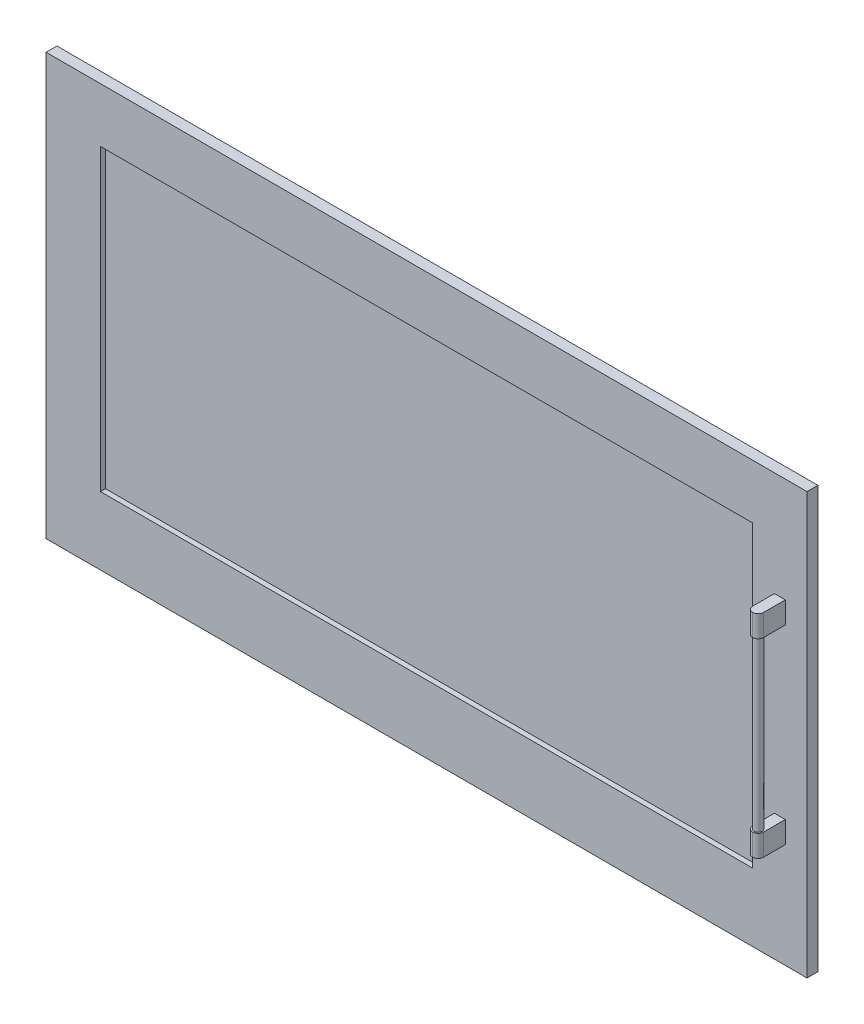
ISO-10303-21;
HEADER;
FILE_DESCRIPTION(('STEP AP214'),'2;1');
FILE_NAME('part.step','',(''),(''),'','','');
FILE_SCHEMA(('AUTOMOTIVE_DESIGN { 1 0 10303 214 1 1 1 1 }'));
ENDSEC;
DATA;
#1=APPLICATION_CONTEXT('core data for automotive mechanical design processes');
#2=APPLICATION_PROTOCOL_DEFINITION('international standard','automotive_design',2000,#1);
#3=PRODUCT_CONTEXT('',#1,'mechanical');
#4=PRODUCT('Part','Part','',(#3));
#5=PRODUCT_RELATED_PRODUCT_CATEGORY('part','',(#4));
#6=PRODUCT_DEFINITION_FORMATION('','',#4);
#7=PRODUCT_DEFINITION_CONTEXT('part definition',#1,'design');
#8=PRODUCT_DEFINITION('design','',#6,#7);
#9=PRODUCT_DEFINITION_SHAPE('','',#8);
#10=(LENGTH_UNIT() NAMED_UNIT(*) SI_UNIT(.MILLI.,.METRE.));
#11=(NAMED_UNIT(*) PLANE_ANGLE_UNIT() SI_UNIT($,.RADIAN.));
#12=(NAMED_UNIT(*) SI_UNIT($,.STERADIAN.) SOLID_ANGLE_UNIT());
#13=UNCERTAINTY_MEASURE_WITH_UNIT(LENGTH_MEASURE(1.E-05),#10,'distance_accuracy_value','');
#14=(GEOMETRIC_REPRESENTATION_CONTEXT(3) GLOBAL_UNCERTAINTY_ASSIGNED_CONTEXT((#13)) GLOBAL_UNIT_ASSIGNED_CONTEXT((#10,
#11,#12)) REPRESENTATION_CONTEXT('',''));
#15=CARTESIAN_POINT('',(0.,0.,0.));
#16=DIRECTION('',(0.,0.,1.));
#17=DIRECTION('',(1.,0.,0.));
#18=AXIS2_PLACEMENT_3D('',#15,#16,#17);
#19=CARTESIAN_POINT('',(-1199.5,574.5,18.));
#20=DIRECTION('',(-1.,0.,0.));
#21=DIRECTION('',(0.,-1.,0.));
#22=AXIS2_PLACEMENT_3D('',#19,#20,#21);
#23=PLANE('',#22);
#24=DIRECTION('',(0.,0.,1.));
#25=VECTOR('',#24,1.);
#26=CARTESIAN_POINT('',(-1199.5,-524.5,18.));
#27=LINE('',#26,#25);
#28=CARTESIAN_POINT('',(-1199.5,-524.5,18.));
#29=VERTEX_POINT('',#28);
#30=CARTESIAN_POINT('',(-1199.5,-524.5,22.));
#31=VERTEX_POINT('',#30);
#32=EDGE_CURVE('E48',#29,#31,#27,.T.);
#33=ORIENTED_EDGE('',*,*,#32,.T.);
#34=DIRECTION('',(0.,-1.,0.));
#35=VECTOR('',#34,1.);
#36=CARTESIAN_POINT('',(-1199.5,574.5,22.));
#37=LINE('',#36,#35);
#38=CARTESIAN_POINT('',(-1199.5,574.5,22.));
#39=VERTEX_POINT('',#38);
#40=EDGE_CURVE('E85',#39,#31,#37,.T.);
#41=ORIENTED_EDGE('',*,*,#40,.F.);
#42=DIRECTION('',(0.,0.,1.));
#43=VECTOR('',#42,1.);
#44=CARTESIAN_POINT('',(-1199.5,574.5,18.));
#45=LINE('',#44,#43);
#46=CARTESIAN_POINT('',(-1199.5,574.5,18.));
#47=VERTEX_POINT('',#46);
#48=EDGE_CURVE('E12',#47,#39,#45,.T.);
#49=ORIENTED_EDGE('',*,*,#48,.F.);
#50=DIRECTION('',(0.,-1.,0.));
#51=VECTOR('',#50,1.);
#52=CARTESIAN_POINT('',(-1199.5,574.5,18.));
#53=LINE('',#52,#51);
#54=EDGE_CURVE('E86',#47,#29,#53,.T.);
#55=ORIENTED_EDGE('',*,*,#54,.T.);
#56=EDGE_LOOP('',(#33,#41,#49,#55));
#57=FACE_BOUND('',#56,.T.);
#58=ADVANCED_FACE('F45',(#57),#23,.T.);
#59=CARTESIAN_POINT('',(-1199.5,574.5,18.));
#60=DIRECTION('',(0.,1.,0.));
#61=DIRECTION('',(0.,0.,1.));
#62=AXIS2_PLACEMENT_3D('',#59,#60,#61);
#63=PLANE('',#62);
#64=ORIENTED_EDGE('',*,*,#48,.T.);
#65=DIRECTION('',(-1.,0.,0.));
#66=VECTOR('',#65,1.);
#67=CARTESIAN_POINT('',(-1199.5,574.5,22.));
#68=LINE('',#67,#66);
#69=CARTESIAN_POINT('',(1199.5,574.5,22.));
#70=VERTEX_POINT('',#69);
#71=EDGE_CURVE('E102',#70,#39,#68,.T.);
#72=ORIENTED_EDGE('',*,*,#71,.F.);
#73=DIRECTION('',(0.,0.,1.));
#74=VECTOR('',#73,1.);
#75=CARTESIAN_POINT('',(1199.5,574.5,18.));
#76=LINE('',#75,#74);
#77=CARTESIAN_POINT('',(1199.5,574.5,18.));
#78=VERTEX_POINT('',#77);
#79=EDGE_CURVE('E53',#78,#70,#76,.T.);
#80=ORIENTED_EDGE('',*,*,#79,.F.);
#81=DIRECTION('',(-1.,0.,0.));
#82=VECTOR('',#81,1.);
#83=CARTESIAN_POINT('',(-1199.5,574.5,18.));
#84=LINE('',#83,#82);
#85=EDGE_CURVE('E91',#78,#47,#84,.T.);
#86=ORIENTED_EDGE('',*,*,#85,.T.);
#87=EDGE_LOOP('',(#64,#72,#80,#86));
#88=FACE_BOUND('',#87,.T.);
#89=ADVANCED_FACE('F117',(#88),#63,.T.);
#90=CARTESIAN_POINT('',(1199.5,574.5,18.));
#91=DIRECTION('',(1.,0.,0.));
#92=DIRECTION('',(0.,1.,0.));
#93=AXIS2_PLACEMENT_3D('',#90,#91,#92);
#94=PLANE('',#93);
#95=ORIENTED_EDGE('',*,*,#79,.T.);
#96=DIRECTION('',(0.,1.,0.));
#97=VECTOR('',#96,1.);
#98=CARTESIAN_POINT('',(1199.5,574.5,22.));
#99=LINE('',#98,#97);
#100=CARTESIAN_POINT('',(1199.5,-524.5,22.));
#101=VERTEX_POINT('',#100);
#102=EDGE_CURVE('E98',#101,#70,#99,.T.);
#103=ORIENTED_EDGE('',*,*,#102,.F.);
#104=DIRECTION('',(0.,0.,1.));
#105=VECTOR('',#104,1.);
#106=CARTESIAN_POINT('',(1199.5,-524.5,18.));
#107=LINE('',#106,#105);
#108=CARTESIAN_POINT('',(1199.5,-524.5,18.));
#109=VERTEX_POINT('',#108);
#110=EDGE_CURVE('E90',#109,#101,#107,.T.);
#111=ORIENTED_EDGE('',*,*,#110,.F.);
#112=DIRECTION('',(0.,1.,0.));
#113=VECTOR('',#112,1.);
#114=CARTESIAN_POINT('',(1199.5,574.5,18.));
#115=LINE('',#114,#113);
#116=EDGE_CURVE('E110',#109,#78,#115,.T.);
#117=ORIENTED_EDGE('',*,*,#116,.T.);
#118=EDGE_LOOP('',(#95,#103,#111,#117));
#119=FACE_BOUND('',#118,.T.);
#120=ADVANCED_FACE('F114',(#119),#94,.T.);
#121=CARTESIAN_POINT('',(-1199.5,-524.5,18.));
#122=DIRECTION('',(0.,-1.,0.));
#123=DIRECTION('',(0.,0.,-1.));
#124=AXIS2_PLACEMENT_3D('',#121,#122,#123);
#125=PLANE('',#124);
#126=ORIENTED_EDGE('',*,*,#110,.T.);
#127=DIRECTION('',(1.,0.,0.));
#128=VECTOR('',#127,1.);
#129=CARTESIAN_POINT('',(-1199.5,-524.5,22.));
#130=LINE('',#129,#128);
#131=EDGE_CURVE('E93',#31,#101,#130,.T.);
#132=ORIENTED_EDGE('',*,*,#131,.F.);
#133=ORIENTED_EDGE('',*,*,#32,.F.);
#134=DIRECTION('',(1.,0.,0.));
#135=VECTOR('',#134,1.);
#136=CARTESIAN_POINT('',(-1199.5,-524.5,18.));
#137=LINE('',#136,#135);
#138=EDGE_CURVE('E108',#29,#109,#137,.T.);
#139=ORIENTED_EDGE('',*,*,#138,.T.);
#140=EDGE_LOOP('',(#126,#132,#133,#139));
#141=FACE_BOUND('',#140,.T.);
#142=ADVANCED_FACE('F94',(#141),#125,.T.);
#143=CARTESIAN_POINT('',(0.,0.,18.));
#144=DIRECTION('',(0.,0.,1.));
#145=DIRECTION('',(1.,0.,0.));
#146=AXIS2_PLACEMENT_3D('',#143,#144,#145);
#147=PLANE('',#146);
#148=ORIENTED_EDGE('',*,*,#54,.F.);
#149=ORIENTED_EDGE('',*,*,#85,.F.);
#150=ORIENTED_EDGE('',*,*,#116,.F.);
#151=ORIENTED_EDGE('',*,*,#138,.F.);
#152=EDGE_LOOP('',(#148,#149,#150,#151));
#153=FACE_BOUND('',#152,.T.);
#154=ADVANCED_FACE('F119',(#153),#147,.F.);
#155=CARTESIAN_POINT('',(0.,0.,22.));
#156=DIRECTION('',(0.,0.,1.));
#157=DIRECTION('',(1.,0.,0.));
#158=AXIS2_PLACEMENT_3D('',#155,#156,#157);
#159=PLANE('',#158);
#160=ORIENTED_EDGE('',*,*,#40,.T.);
#161=ORIENTED_EDGE('',*,*,#131,.T.);
#162=ORIENTED_EDGE('',*,*,#102,.T.);
#163=ORIENTED_EDGE('',*,*,#71,.T.);
#164=EDGE_LOOP('',(#160,#161,#162,#163));
#165=FACE_BOUND('',#164,.T.);
#166=ADVANCED_FACE('F101',(#165),#159,.T.);
#167=CLOSED_SHELL('',(#58,#89,#120,#142,#154,#166));
#168=MANIFOLD_SOLID_BREP('B2',#167);
#169=CARTESIAN_POINT('',(0.,0.,40.));
#170=DIRECTION('',(0.,0.,1.));
#171=DIRECTION('',(1.,0.,0.));
#172=AXIS2_PLACEMENT_3D('',#169,#170,#171);
#173=PLANE('',#172);
#174=DIRECTION('',(0.,-1.,0.));
#175=VECTOR('',#174,1.);
#176=CARTESIAN_POINT('',(-1200.,575.,40.));
#177=LINE('',#176,#175);
#178=CARTESIAN_POINT('',(-1200.,575.,40.));
#179=VERTEX_POINT('',#178);
#180=CARTESIAN_POINT('',(-1200.,-525.,40.));
#181=VERTEX_POINT('',#180);
#182=EDGE_CURVE('E183',#179,#181,#177,.T.);
#183=ORIENTED_EDGE('',*,*,#182,.F.);
#184=DIRECTION('',(-1.,0.,0.));
#185=VECTOR('',#184,1.);
#186=CARTESIAN_POINT('',(-1200.,575.,40.));
#187=LINE('',#186,#185);
#188=CARTESIAN_POINT('',(1200.,575.,40.));
#189=VERTEX_POINT('',#188);
#190=EDGE_CURVE('E311',#189,#179,#187,.T.);
#191=ORIENTED_EDGE('',*,*,#190,.F.);
#192=DIRECTION('',(0.,1.,0.));
#193=VECTOR('',#192,1.);
#194=CARTESIAN_POINT('',(1200.,575.,40.));
#195=LINE('',#194,#193);
#196=CARTESIAN_POINT('',(1200.,-525.,40.));
#197=VERTEX_POINT('',#196);
#198=EDGE_CURVE('E296',#197,#189,#195,.T.);
#199=ORIENTED_EDGE('',*,*,#198,.F.);
#200=DIRECTION('',(1.,0.,0.));
#201=VECTOR('',#200,1.);
#202=CARTESIAN_POINT('',(-1200.,-525.,40.));
#203=LINE('',#202,#201);
#204=EDGE_CURVE('E305',#181,#197,#203,.T.);
#205=ORIENTED_EDGE('',*,*,#204,.F.);
#206=EDGE_LOOP('',(#183,#191,#199,#205));
#207=FACE_BOUND('',#206,.T.);
#208=DIRECTION('',(0.,1.,0.));
#209=VECTOR('',#208,1.);
#210=CARTESIAN_POINT('',(1400.,775.,40.));
#211=LINE('',#210,#209);
#212=CARTESIAN_POINT('',(1400.,-775.,40.));
#213=VERTEX_POINT('',#212);
#214=CARTESIAN_POINT('',(1400.,775.,40.));
#215=VERTEX_POINT('',#214);
#216=EDGE_CURVE('E363',#213,#215,#211,.T.);
#217=ORIENTED_EDGE('',*,*,#216,.T.);
#218=DIRECTION('',(-1.,0.,0.));
#219=VECTOR('',#218,1.);
#220=CARTESIAN_POINT('',(-1400.,775.,40.));
#221=LINE('',#220,#219);
#222=CARTESIAN_POINT('',(-1400.,775.,40.));
#223=VERTEX_POINT('',#222);
#224=EDGE_CURVE('E366',#215,#223,#221,.T.);
#225=ORIENTED_EDGE('',*,*,#224,.T.);
#226=DIRECTION('',(0.,-1.,0.));
#227=VECTOR('',#226,1.);
#228=CARTESIAN_POINT('',(-1400.,775.,40.));
#229=LINE('',#228,#227);
#230=CARTESIAN_POINT('',(-1400.,-775.,40.));
#231=VERTEX_POINT('',#230);
#232=EDGE_CURVE('E369',#223,#231,#229,.T.);
#233=ORIENTED_EDGE('',*,*,#232,.T.);
#234=DIRECTION('',(1.,0.,0.));
#235=VECTOR('',#234,1.);
#236=CARTESIAN_POINT('',(-1400.,-775.,40.));
#237=LINE('',#236,#235);
#238=EDGE_CURVE('E371',#231,#213,#237,.T.);
#239=ORIENTED_EDGE('',*,*,#238,.T.);
#240=EDGE_LOOP('',(#217,#225,#233,#239));
#241=FACE_BOUND('',#240,.T.);
#242=DIRECTION('',(-1.,0.,0.));
#243=VECTOR('',#242,1.);
#244=CARTESIAN_POINT('',(1280.,390.,40.));
#245=LINE('',#244,#243);
#246=CARTESIAN_POINT('',(1320.,390.,40.));
#247=VERTEX_POINT('',#246);
#248=CARTESIAN_POINT('',(1280.,390.,40.));
#249=VERTEX_POINT('',#248);
#250=EDGE_CURVE('E345',#247,#249,#245,.T.);
#251=ORIENTED_EDGE('',*,*,#250,.F.);
#252=DIRECTION('',(0.,1.,0.));
#253=VECTOR('',#252,1.);
#254=CARTESIAN_POINT('',(1320.,310.,40.));
#255=LINE('',#254,#253);
#256=CARTESIAN_POINT('',(1320.,310.,40.));
#257=VERTEX_POINT('',#256);
#258=EDGE_CURVE('E342',#257,#247,#255,.T.);
#259=ORIENTED_EDGE('',*,*,#258,.F.);
#260=DIRECTION('',(1.,0.,0.));
#261=VECTOR('',#260,1.);
#262=CARTESIAN_POINT('',(1280.,310.,40.));
#263=LINE('',#262,#261);
#264=CARTESIAN_POINT('',(1280.,310.,40.));
#265=VERTEX_POINT('',#264);
#266=EDGE_CURVE('E351',#265,#257,#263,.T.);
#267=ORIENTED_EDGE('',*,*,#266,.F.);
#268=DIRECTION('',(0.,-1.,0.));
#269=VECTOR('',#268,1.);
#270=CARTESIAN_POINT('',(1280.,310.,40.));
#271=LINE('',#270,#269);
#272=EDGE_CURVE('E348',#249,#265,#271,.T.);
#273=ORIENTED_EDGE('',*,*,#272,.F.);
#274=EDGE_LOOP('',(#251,#259,#267,#273));
#275=FACE_BOUND('',#274,.T.);
#276=DIRECTION('',(-1.,0.,0.));
#277=VECTOR('',#276,1.);
#278=CARTESIAN_POINT('',(1280.,-310.,40.));
#279=LINE('',#278,#277);
#280=CARTESIAN_POINT('',(1320.,-310.,40.));
#281=VERTEX_POINT('',#280);
#282=CARTESIAN_POINT('',(1280.,-310.,40.));
#283=VERTEX_POINT('',#282);
#284=EDGE_CURVE('E324',#281,#283,#279,.T.);
#285=ORIENTED_EDGE('',*,*,#284,.F.);
#286=DIRECTION('',(0.,1.,0.));
#287=VECTOR('',#286,1.);
#288=CARTESIAN_POINT('',(1320.,-390.,40.));
#289=LINE('',#288,#287);
#290=CARTESIAN_POINT('',(1320.,-390.,40.));
#291=VERTEX_POINT('',#290);
#292=EDGE_CURVE('E321',#291,#281,#289,.T.);
#293=ORIENTED_EDGE('',*,*,#292,.F.);
#294=DIRECTION('',(1.,0.,0.));
#295=VECTOR('',#294,1.);
#296=CARTESIAN_POINT('',(1280.,-390.,40.));
#297=LINE('',#296,#295);
#298=CARTESIAN_POINT('',(1280.,-390.,40.));
#299=VERTEX_POINT('',#298);
#300=EDGE_CURVE('E330',#299,#291,#297,.T.);
#301=ORIENTED_EDGE('',*,*,#300,.F.);
#302=DIRECTION('',(0.,-1.,0.));
#303=VECTOR('',#302,1.);
#304=CARTESIAN_POINT('',(1280.,-390.,40.));
#305=LINE('',#304,#303);
#306=EDGE_CURVE('E327',#283,#299,#305,.T.);
#307=ORIENTED_EDGE('',*,*,#306,.F.);
#308=EDGE_LOOP('',(#285,#293,#301,#307));
#309=FACE_BOUND('',#308,.T.);
#310=ADVANCED_FACE('F168',(#207,#241,#275,#309),#173,.T.);
#311=CARTESIAN_POINT('',(1400.,775.,40.));
#312=DIRECTION('',(-1.,0.,0.));
#313=DIRECTION('',(0.,0.,1.));
#314=AXIS2_PLACEMENT_3D('',#311,#312,#313);
#315=PLANE('',#314);
#316=DIRECTION('',(0.,1.,0.));
#317=VECTOR('',#316,1.);
#318=CARTESIAN_POINT('',(1400.,775.,0.));
#319=LINE('',#318,#317);
#320=CARTESIAN_POINT('',(1400.,-775.,0.));
#321=VERTEX_POINT('',#320);
#322=CARTESIAN_POINT('',(1400.,775.,0.));
#323=VERTEX_POINT('',#322);
#324=EDGE_CURVE('E362',#321,#323,#319,.T.);
#325=ORIENTED_EDGE('',*,*,#324,.T.);
#326=DIRECTION('',(0.,0.,-1.));
#327=VECTOR('',#326,1.);
#328=CARTESIAN_POINT('',(1400.,775.,40.));
#329=LINE('',#328,#327);
#330=EDGE_CURVE('E389',#215,#323,#329,.T.);
#331=ORIENTED_EDGE('',*,*,#330,.F.);
#332=ORIENTED_EDGE('',*,*,#216,.F.);
#333=DIRECTION('',(0.,0.,-1.));
#334=VECTOR('',#333,1.);
#335=CARTESIAN_POINT('',(1400.,-775.,40.));
#336=LINE('',#335,#334);
#337=EDGE_CURVE('E373',#213,#321,#336,.T.);
#338=ORIENTED_EDGE('',*,*,#337,.T.);
#339=EDGE_LOOP('',(#325,#331,#332,#338));
#340=FACE_BOUND('',#339,.T.);
#341=ADVANCED_FACE('F451',(#340),#315,.F.);
#342=CARTESIAN_POINT('',(-1400.,775.,40.));
#343=DIRECTION('',(0.,-1.,0.));
#344=DIRECTION('',(0.,0.,-1.));
#345=AXIS2_PLACEMENT_3D('',#342,#343,#344);
#346=PLANE('',#345);
#347=DIRECTION('',(-1.,0.,0.));
#348=VECTOR('',#347,1.);
#349=CARTESIAN_POINT('',(-1400.,775.,0.));
#350=LINE('',#349,#348);
#351=CARTESIAN_POINT('',(-1400.,775.,0.));
#352=VERTEX_POINT('',#351);
#353=EDGE_CURVE('E376',#323,#352,#350,.T.);
#354=ORIENTED_EDGE('',*,*,#353,.T.);
#355=DIRECTION('',(0.,0.,-1.));
#356=VECTOR('',#355,1.);
#357=CARTESIAN_POINT('',(-1400.,775.,40.));
#358=LINE('',#357,#356);
#359=EDGE_CURVE('E386',#223,#352,#358,.T.);
#360=ORIENTED_EDGE('',*,*,#359,.F.);
#361=ORIENTED_EDGE('',*,*,#224,.F.);
#362=ORIENTED_EDGE('',*,*,#330,.T.);
#363=EDGE_LOOP('',(#354,#360,#361,#362));
#364=FACE_BOUND('',#363,.T.);
#365=ADVANCED_FACE('F456',(#364),#346,.F.);
#366=CARTESIAN_POINT('',(-1400.,775.,40.));
#367=DIRECTION('',(1.,0.,0.));
#368=DIRECTION('',(0.,0.,-1.));
#369=AXIS2_PLACEMENT_3D('',#366,#367,#368);
#370=PLANE('',#369);
#371=DIRECTION('',(0.,-1.,0.));
#372=VECTOR('',#371,1.);
#373=CARTESIAN_POINT('',(-1400.,775.,0.));
#374=LINE('',#373,#372);
#375=CARTESIAN_POINT('',(-1400.,-775.,0.));
#376=VERTEX_POINT('',#375);
#377=EDGE_CURVE('E378',#352,#376,#374,.T.);
#378=ORIENTED_EDGE('',*,*,#377,.T.);
#379=DIRECTION('',(0.,0.,-1.));
#380=VECTOR('',#379,1.);
#381=CARTESIAN_POINT('',(-1400.,-775.,40.));
#382=LINE('',#381,#380);
#383=EDGE_CURVE('E383',#231,#376,#382,.T.);
#384=ORIENTED_EDGE('',*,*,#383,.F.);
#385=ORIENTED_EDGE('',*,*,#232,.F.);
#386=ORIENTED_EDGE('',*,*,#359,.T.);
#387=EDGE_LOOP('',(#378,#384,#385,#386));
#388=FACE_BOUND('',#387,.T.);
#389=ADVANCED_FACE('F468',(#388),#370,.F.);
#390=CARTESIAN_POINT('',(-1400.,-775.,40.));
#391=DIRECTION('',(0.,1.,0.));
#392=DIRECTION('',(0.,0.,1.));
#393=AXIS2_PLACEMENT_3D('',#390,#391,#392);
#394=PLANE('',#393);
#395=DIRECTION('',(1.,0.,0.));
#396=VECTOR('',#395,1.);
#397=CARTESIAN_POINT('',(-1400.,-775.,0.));
#398=LINE('',#397,#396);
#399=EDGE_CURVE('E367',#376,#321,#398,.T.);
#400=ORIENTED_EDGE('',*,*,#399,.T.);
#401=ORIENTED_EDGE('',*,*,#337,.F.);
#402=ORIENTED_EDGE('',*,*,#238,.F.);
#403=ORIENTED_EDGE('',*,*,#383,.T.);
#404=EDGE_LOOP('',(#400,#401,#402,#403));
#405=FACE_BOUND('',#404,.T.);
#406=ADVANCED_FACE('F465',(#405),#394,.F.);
#407=CARTESIAN_POINT('',(0.,0.,0.));
#408=DIRECTION('',(0.,0.,1.));
#409=DIRECTION('',(1.,0.,0.));
#410=AXIS2_PLACEMENT_3D('',#407,#408,#409);
#411=PLANE('',#410);
#412=DIRECTION('',(-1.,0.,0.));
#413=VECTOR('',#412,1.);
#414=CARTESIAN_POINT('',(0.,575.,0.));
#415=LINE('',#414,#413);
#416=CARTESIAN_POINT('',(1200.,575.,0.));
#417=VERTEX_POINT('',#416);
#418=CARTESIAN_POINT('',(-1200.,575.,0.));
#419=VERTEX_POINT('',#418);
#420=EDGE_CURVE('E176',#417,#419,#415,.T.);
#421=ORIENTED_EDGE('',*,*,#420,.T.);
#422=DIRECTION('',(0.,-1.,0.));
#423=VECTOR('',#422,1.);
#424=CARTESIAN_POINT('',(-1200.,-2.42230478100034E-13,0.));
#425=LINE('',#424,#423);
#426=CARTESIAN_POINT('',(-1200.,-525.,0.));
#427=VERTEX_POINT('',#426);
#428=EDGE_CURVE('E43',#419,#427,#425,.T.);
#429=ORIENTED_EDGE('',*,*,#428,.T.);
#430=DIRECTION('',(1.,0.,0.));
#431=VECTOR('',#430,1.);
#432=CARTESIAN_POINT('',(0.,-525.,0.));
#433=LINE('',#432,#431);
#434=CARTESIAN_POINT('',(1200.,-525.,0.));
#435=VERTEX_POINT('',#434);
#436=EDGE_CURVE('E428',#427,#435,#433,.T.);
#437=ORIENTED_EDGE('',*,*,#436,.T.);
#438=DIRECTION('',(0.,1.,0.));
#439=VECTOR('',#438,1.);
#440=CARTESIAN_POINT('',(1200.,2.42230478100034E-13,0.));
#441=LINE('',#440,#439);
#442=EDGE_CURVE('E299',#435,#417,#441,.T.);
#443=ORIENTED_EDGE('',*,*,#442,.T.);
#444=EDGE_LOOP('',(#421,#429,#437,#443));
#445=FACE_BOUND('',#444,.T.);
#446=ORIENTED_EDGE('',*,*,#324,.F.);
#447=ORIENTED_EDGE('',*,*,#399,.F.);
#448=ORIENTED_EDGE('',*,*,#377,.F.);
#449=ORIENTED_EDGE('',*,*,#353,.F.);
#450=EDGE_LOOP('',(#446,#447,#448,#449));
#451=FACE_BOUND('',#450,.T.);
#452=ADVANCED_FACE('F432',(#445,#451),#411,.F.);
#453=CARTESIAN_POINT('',(1320.,310.,140.));
#454=DIRECTION('',(-1.,0.,0.));
#455=DIRECTION('',(0.,0.,1.));
#456=AXIS2_PLACEMENT_3D('',#453,#454,#455);
#457=PLANE('',#456);
#458=DIRECTION('',(0.,0.,-1.));
#459=VECTOR('',#458,1.);
#460=CARTESIAN_POINT('',(1320.,390.,140.));
#461=LINE('',#460,#459);
#462=CARTESIAN_POINT('',(1320.,390.,120.));
#463=VERTEX_POINT('',#462);
#464=EDGE_CURVE('E360',#463,#247,#461,.T.);
#465=ORIENTED_EDGE('',*,*,#464,.F.);
#466=DIRECTION('',(0.,1.,0.));
#467=VECTOR('',#466,1.);
#468=CARTESIAN_POINT('',(1320.,310.,120.));
#469=LINE('',#468,#467);
#470=CARTESIAN_POINT('',(1320.,310.,120.));
#471=VERTEX_POINT('',#470);
#472=EDGE_CURVE('E403',#463,#471,#469,.F.);
#473=ORIENTED_EDGE('',*,*,#472,.T.);
#474=DIRECTION('',(0.,0.,-1.));
#475=VECTOR('',#474,1.);
#476=CARTESIAN_POINT('',(1320.,310.,140.));
#477=LINE('',#476,#475);
#478=EDGE_CURVE('E354',#471,#257,#477,.T.);
#479=ORIENTED_EDGE('',*,*,#478,.T.);
#480=ORIENTED_EDGE('',*,*,#258,.T.);
#481=EDGE_LOOP('',(#465,#473,#479,#480));
#482=FACE_BOUND('',#481,.T.);
#483=ADVANCED_FACE('F461',(#482),#457,.F.);
#484=CARTESIAN_POINT('',(1280.,390.,140.));
#485=DIRECTION('',(0.,-1.,0.));
#486=DIRECTION('',(0.,0.,-1.));
#487=AXIS2_PLACEMENT_3D('',#484,#485,#486);
#488=PLANE('',#487);
#489=DIRECTION('',(0.,0.,-1.));
#490=VECTOR('',#489,1.);
#491=CARTESIAN_POINT('',(1280.,390.,140.));
#492=LINE('',#491,#490);
#493=CARTESIAN_POINT('',(1280.,390.,120.));
#494=VERTEX_POINT('',#493);
#495=EDGE_CURVE('E358',#494,#249,#492,.T.);
#496=ORIENTED_EDGE('',*,*,#495,.F.);
#497=CARTESIAN_POINT('',(1300.,390.,120.));
#498=DIRECTION('',(0.,-1.,0.));
#499=DIRECTION('',(0.,0.,-1.));
#500=AXIS2_PLACEMENT_3D('',#497,#498,#499);
#501=CIRCLE('',#500,20.);
#502=CARTESIAN_POINT('',(1300.,390.,140.));
#503=VERTEX_POINT('',#502);
#504=EDGE_CURVE('E401',#494,#503,#501,.F.);
#505=ORIENTED_EDGE('',*,*,#504,.T.);
#506=CARTESIAN_POINT('',(1300.,390.,120.));
#507=DIRECTION('',(0.,-1.,0.));
#508=DIRECTION('',(0.,0.,-1.));
#509=AXIS2_PLACEMENT_3D('',#506,#507,#508);
#510=CIRCLE('',#509,20.);
#511=EDGE_CURVE('E399',#503,#463,#510,.F.);
#512=ORIENTED_EDGE('',*,*,#511,.T.);
#513=ORIENTED_EDGE('',*,*,#464,.T.);
#514=ORIENTED_EDGE('',*,*,#250,.T.);
#515=EDGE_LOOP('',(#496,#505,#512,#513,#514));
#516=FACE_BOUND('',#515,.T.);
#517=ADVANCED_FACE('F527',(#516),#488,.F.);
#518=CARTESIAN_POINT('',(1280.,310.,140.));
#519=DIRECTION('',(1.,0.,0.));
#520=DIRECTION('',(0.,0.,-1.));
#521=AXIS2_PLACEMENT_3D('',#518,#519,#520);
#522=PLANE('',#521);
#523=DIRECTION('',(0.,0.,-1.));
#524=VECTOR('',#523,1.);
#525=CARTESIAN_POINT('',(1280.,310.,140.));
#526=LINE('',#525,#524);
#527=CARTESIAN_POINT('',(1280.,310.,120.));
#528=VERTEX_POINT('',#527);
#529=EDGE_CURVE('E356',#528,#265,#526,.T.);
#530=ORIENTED_EDGE('',*,*,#529,.F.);
#531=DIRECTION('',(0.,-1.,0.));
#532=VECTOR('',#531,1.);
#533=CARTESIAN_POINT('',(1280.,310.,120.));
#534=LINE('',#533,#532);
#535=EDGE_CURVE('E396',#528,#494,#534,.F.);
#536=ORIENTED_EDGE('',*,*,#535,.T.);
#537=ORIENTED_EDGE('',*,*,#495,.T.);
#538=ORIENTED_EDGE('',*,*,#272,.T.);
#539=EDGE_LOOP('',(#530,#536,#537,#538));
#540=FACE_BOUND('',#539,.T.);
#541=ADVANCED_FACE('F524',(#540),#522,.F.);
#542=CARTESIAN_POINT('',(1280.,310.,140.));
#543=DIRECTION('',(0.,1.,0.));
#544=DIRECTION('',(0.,0.,1.));
#545=AXIS2_PLACEMENT_3D('',#542,#543,#544);
#546=PLANE('',#545);
#547=CARTESIAN_POINT('',(1300.,310.,120.));
#548=DIRECTION('',(0.,1.,0.));
#549=DIRECTION('',(0.,0.,1.));
#550=AXIS2_PLACEMENT_3D('',#547,#548,#549);
#551=CIRCLE('',#550,14.9999999999999);
#552=CARTESIAN_POINT('',(1300.,310.,135.));
#553=VERTEX_POINT('',#552);
#554=EDGE_CURVE('E425',#553,#553,#551,.F.);
#555=ORIENTED_EDGE('',*,*,#554,.F.);
#556=EDGE_LOOP('',(#555));
#557=FACE_BOUND('',#556,.T.);
#558=CARTESIAN_POINT('',(1300.,310.,120.));
#559=DIRECTION('',(0.,1.,0.));
#560=DIRECTION('',(0.,0.,1.));
#561=AXIS2_PLACEMENT_3D('',#558,#559,#560);
#562=CIRCLE('',#561,20.);
#563=CARTESIAN_POINT('',(1300.,310.,140.));
#564=VERTEX_POINT('',#563);
#565=EDGE_CURVE('E392',#471,#564,#562,.F.);
#566=ORIENTED_EDGE('',*,*,#565,.T.);
#567=CARTESIAN_POINT('',(1300.,310.,120.));
#568=DIRECTION('',(0.,1.,0.));
#569=DIRECTION('',(0.,0.,1.));
#570=AXIS2_PLACEMENT_3D('',#567,#568,#569);
#571=CIRCLE('',#570,20.);
#572=EDGE_CURVE('E394',#564,#528,#571,.F.);
#573=ORIENTED_EDGE('',*,*,#572,.T.);
#574=ORIENTED_EDGE('',*,*,#529,.T.);
#575=ORIENTED_EDGE('',*,*,#266,.T.);
#576=ORIENTED_EDGE('',*,*,#478,.F.);
#577=EDGE_LOOP('',(#566,#573,#574,#575,#576));
#578=FACE_BOUND('',#577,.T.);
#579=ADVANCED_FACE('F483',(#557,#578),#546,.F.);
#580=CARTESIAN_POINT('',(1300.,0.,120.));
#581=DIRECTION('',(0.,1.,0.));
#582=DIRECTION('',(0.,0.,1.));
#583=AXIS2_PLACEMENT_3D('',#580,#581,#582);
#584=CYLINDRICAL_SURFACE('',#583,20.);
#585=ORIENTED_EDGE('',*,*,#472,.F.);
#586=ORIENTED_EDGE('',*,*,#511,.F.);
#587=DIRECTION('',(0.,1.,0.));
#588=VECTOR('',#587,1.);
#589=CARTESIAN_POINT('',(1300.,0.,140.));
#590=LINE('',#589,#588);
#591=EDGE_CURVE('E341',#564,#503,#590,.T.);
#592=ORIENTED_EDGE('',*,*,#591,.F.);
#593=ORIENTED_EDGE('',*,*,#565,.F.);
#594=EDGE_LOOP('',(#585,#586,#592,#593));
#595=FACE_BOUND('',#594,.T.);
#596=ADVANCED_FACE('F480',(#595),#584,.T.);
#597=CARTESIAN_POINT('',(1300.,0.,120.));
#598=DIRECTION('',(0.,-1.,0.));
#599=DIRECTION('',(0.,0.,-1.));
#600=AXIS2_PLACEMENT_3D('',#597,#598,#599);
#601=CYLINDRICAL_SURFACE('',#600,20.);
#602=ORIENTED_EDGE('',*,*,#504,.F.);
#603=ORIENTED_EDGE('',*,*,#535,.F.);
#604=ORIENTED_EDGE('',*,*,#572,.F.);
#605=ORIENTED_EDGE('',*,*,#591,.T.);
#606=EDGE_LOOP('',(#602,#603,#604,#605));
#607=FACE_BOUND('',#606,.T.);
#608=ADVANCED_FACE('F476',(#607),#601,.T.);
#609=CARTESIAN_POINT('',(1320.,-390.,140.));
#610=DIRECTION('',(-1.,0.,0.));
#611=DIRECTION('',(0.,0.,1.));
#612=AXIS2_PLACEMENT_3D('',#609,#610,#611);
#613=PLANE('',#612);
#614=DIRECTION('',(0.,0.,-1.));
#615=VECTOR('',#614,1.);
#616=CARTESIAN_POINT('',(1320.,-310.,140.));
#617=LINE('',#616,#615);
#618=CARTESIAN_POINT('',(1320.,-310.,120.));
#619=VERTEX_POINT('',#618);
#620=EDGE_CURVE('E339',#619,#281,#617,.T.);
#621=ORIENTED_EDGE('',*,*,#620,.F.);
#622=DIRECTION('',(0.,1.,0.));
#623=VECTOR('',#622,1.);
#624=CARTESIAN_POINT('',(1320.,-390.,120.));
#625=LINE('',#624,#623);
#626=CARTESIAN_POINT('',(1320.,-390.,120.));
#627=VERTEX_POINT('',#626);
#628=EDGE_CURVE('E418',#619,#627,#625,.F.);
#629=ORIENTED_EDGE('',*,*,#628,.T.);
#630=DIRECTION('',(0.,0.,-1.));
#631=VECTOR('',#630,1.);
#632=CARTESIAN_POINT('',(1320.,-390.,140.));
#633=LINE('',#632,#631);
#634=EDGE_CURVE('E333',#627,#291,#633,.T.);
#635=ORIENTED_EDGE('',*,*,#634,.T.);
#636=ORIENTED_EDGE('',*,*,#292,.T.);
#637=EDGE_LOOP('',(#621,#629,#635,#636));
#638=FACE_BOUND('',#637,.T.);
#639=ADVANCED_FACE('F479',(#638),#613,.F.);
#640=CARTESIAN_POINT('',(1280.,-310.,140.));
#641=DIRECTION('',(0.,-1.,0.));
#642=DIRECTION('',(0.,0.,-1.));
#643=AXIS2_PLACEMENT_3D('',#640,#641,#642);
#644=PLANE('',#643);
#645=CARTESIAN_POINT('',(1300.,-310.,120.));
#646=DIRECTION('',(0.,-1.,0.));
#647=DIRECTION('',(0.,0.,-1.));
#648=AXIS2_PLACEMENT_3D('',#645,#646,#647);
#649=CIRCLE('',#648,14.9999999999999);
#650=CARTESIAN_POINT('',(1300.,-310.,105.));
#651=VERTEX_POINT('',#650);
#652=EDGE_CURVE('E420',#651,#651,#649,.F.);
#653=ORIENTED_EDGE('',*,*,#652,.F.);
#654=EDGE_LOOP('',(#653));
#655=FACE_BOUND('',#654,.T.);
#656=DIRECTION('',(0.,0.,-1.));
#657=VECTOR('',#656,1.);
#658=CARTESIAN_POINT('',(1280.,-310.,140.));
#659=LINE('',#658,#657);
#660=CARTESIAN_POINT('',(1280.,-310.,120.));
#661=VERTEX_POINT('',#660);
#662=EDGE_CURVE('E337',#661,#283,#659,.T.);
#663=ORIENTED_EDGE('',*,*,#662,.F.);
#664=CARTESIAN_POINT('',(1300.,-310.,120.));
#665=DIRECTION('',(0.,-1.,0.));
#666=DIRECTION('',(0.,0.,-1.));
#667=AXIS2_PLACEMENT_3D('',#664,#665,#666);
#668=CIRCLE('',#667,20.);
#669=CARTESIAN_POINT('',(1300.,-310.,140.));
#670=VERTEX_POINT('',#669);
#671=EDGE_CURVE('E416',#661,#670,#668,.F.);
#672=ORIENTED_EDGE('',*,*,#671,.T.);
#673=CARTESIAN_POINT('',(1300.,-310.,120.));
#674=DIRECTION('',(0.,-1.,0.));
#675=DIRECTION('',(0.,0.,-1.));
#676=AXIS2_PLACEMENT_3D('',#673,#674,#675);
#677=CIRCLE('',#676,20.);
#678=EDGE_CURVE('E414',#670,#619,#677,.F.);
#679=ORIENTED_EDGE('',*,*,#678,.T.);
#680=ORIENTED_EDGE('',*,*,#620,.T.);
#681=ORIENTED_EDGE('',*,*,#284,.T.);
#682=EDGE_LOOP('',(#663,#672,#679,#680,#681));
#683=FACE_BOUND('',#682,.T.);
#684=ADVANCED_FACE('F501',(#655,#683),#644,.F.);
#685=CARTESIAN_POINT('',(1280.,-390.,140.));
#686=DIRECTION('',(1.,0.,0.));
#687=DIRECTION('',(0.,0.,-1.));
#688=AXIS2_PLACEMENT_3D('',#685,#686,#687);
#689=PLANE('',#688);
#690=DIRECTION('',(0.,0.,-1.));
#691=VECTOR('',#690,1.);
#692=CARTESIAN_POINT('',(1280.,-390.,140.));
#693=LINE('',#692,#691);
#694=CARTESIAN_POINT('',(1280.,-390.,120.));
#695=VERTEX_POINT('',#694);
#696=EDGE_CURVE('E335',#695,#299,#693,.T.);
#697=ORIENTED_EDGE('',*,*,#696,.F.);
#698=DIRECTION('',(0.,-1.,0.));
#699=VECTOR('',#698,1.);
#700=CARTESIAN_POINT('',(1280.,-390.,120.));
#701=LINE('',#700,#699);
#702=EDGE_CURVE('E411',#695,#661,#701,.F.);
#703=ORIENTED_EDGE('',*,*,#702,.T.);
#704=ORIENTED_EDGE('',*,*,#662,.T.);
#705=ORIENTED_EDGE('',*,*,#306,.T.);
#706=EDGE_LOOP('',(#697,#703,#704,#705));
#707=FACE_BOUND('',#706,.T.);
#708=ADVANCED_FACE('F500',(#707),#689,.F.);
#709=CARTESIAN_POINT('',(1280.,-390.,140.));
#710=DIRECTION('',(0.,1.,0.));
#711=DIRECTION('',(0.,0.,1.));
#712=AXIS2_PLACEMENT_3D('',#709,#710,#711);
#713=PLANE('',#712);
#714=CARTESIAN_POINT('',(1300.,-390.,120.));
#715=DIRECTION('',(0.,1.,0.));
#716=DIRECTION('',(0.,0.,1.));
#717=AXIS2_PLACEMENT_3D('',#714,#715,#716);
#718=CIRCLE('',#717,20.);
#719=CARTESIAN_POINT('',(1300.,-390.,140.));
#720=VERTEX_POINT('',#719);
#721=EDGE_CURVE('E405',#627,#720,#718,.F.);
#722=ORIENTED_EDGE('',*,*,#721,.T.);
#723=CARTESIAN_POINT('',(1300.,-390.,120.));
#724=DIRECTION('',(0.,1.,0.));
#725=DIRECTION('',(0.,0.,1.));
#726=AXIS2_PLACEMENT_3D('',#723,#724,#725);
#727=CIRCLE('',#726,20.);
#728=EDGE_CURVE('E409',#720,#695,#727,.F.);
#729=ORIENTED_EDGE('',*,*,#728,.T.);
#730=ORIENTED_EDGE('',*,*,#696,.T.);
#731=ORIENTED_EDGE('',*,*,#300,.T.);
#732=ORIENTED_EDGE('',*,*,#634,.F.);
#733=EDGE_LOOP('',(#722,#729,#730,#731,#732));
#734=FACE_BOUND('',#733,.T.);
#735=ADVANCED_FACE('F490',(#734),#713,.F.);
#736=CARTESIAN_POINT('',(1300.,-700.,120.));
#737=DIRECTION('',(0.,1.,0.));
#738=DIRECTION('',(0.,0.,1.));
#739=AXIS2_PLACEMENT_3D('',#736,#737,#738);
#740=CYLINDRICAL_SURFACE('',#739,20.);
#741=ORIENTED_EDGE('',*,*,#628,.F.);
#742=ORIENTED_EDGE('',*,*,#678,.F.);
#743=DIRECTION('',(0.,1.,0.));
#744=VECTOR('',#743,1.);
#745=CARTESIAN_POINT('',(1300.,-700.,140.));
#746=LINE('',#745,#744);
#747=EDGE_CURVE('E318',#720,#670,#746,.T.);
#748=ORIENTED_EDGE('',*,*,#747,.F.);
#749=ORIENTED_EDGE('',*,*,#721,.F.);
#750=EDGE_LOOP('',(#741,#742,#748,#749));
#751=FACE_BOUND('',#750,.T.);
#752=ADVANCED_FACE('F170',(#751),#740,.T.);
#753=CARTESIAN_POINT('',(1300.,-700.,120.));
#754=DIRECTION('',(0.,-1.,0.));
#755=DIRECTION('',(0.,0.,-1.));
#756=AXIS2_PLACEMENT_3D('',#753,#754,#755);
#757=CYLINDRICAL_SURFACE('',#756,20.);
#758=ORIENTED_EDGE('',*,*,#671,.F.);
#759=ORIENTED_EDGE('',*,*,#702,.F.);
#760=ORIENTED_EDGE('',*,*,#728,.F.);
#761=ORIENTED_EDGE('',*,*,#747,.T.);
#762=EDGE_LOOP('',(#758,#759,#760,#761));
#763=FACE_BOUND('',#762,.T.);
#764=ADVANCED_FACE('F446',(#763),#757,.T.);
#765=CARTESIAN_POINT('',(1300.,352.426406871193,120.));
#766=DIRECTION('',(0.,-1.,0.));
#767=DIRECTION('',(0.,0.,-1.));
#768=AXIS2_PLACEMENT_3D('',#765,#766,#767);
#769=CYLINDRICAL_SURFACE('',#768,14.9999999999999);
#770=ORIENTED_EDGE('',*,*,#652,.T.);
#771=EDGE_LOOP('',(#770));
#772=FACE_BOUND('',#771,.T.);
#773=ORIENTED_EDGE('',*,*,#554,.T.);
#774=EDGE_LOOP('',(#773));
#775=FACE_BOUND('',#774,.T.);
#776=ADVANCED_FACE('F439',(#772,#775),#769,.T.);
#777=CARTESIAN_POINT('',(-1200.,575.,-612.));
#778=DIRECTION('',(-1.,0.,0.));
#779=DIRECTION('',(0.,-1.,0.));
#780=AXIS2_PLACEMENT_3D('',#777,#778,#779);
#781=PLANE('',#780);
#782=DIRECTION('',(0.,0.,1.));
#783=VECTOR('',#782,1.);
#784=CARTESIAN_POINT('',(-1200.,575.,-612.));
#785=LINE('',#784,#783);
#786=EDGE_CURVE('E316',#419,#179,#785,.T.);
#787=ORIENTED_EDGE('',*,*,#786,.T.);
#788=ORIENTED_EDGE('',*,*,#182,.T.);
#789=DIRECTION('',(0.,0.,1.));
#790=VECTOR('',#789,1.);
#791=CARTESIAN_POINT('',(-1200.,-525.,-612.));
#792=LINE('',#791,#790);
#793=EDGE_CURVE('E302',#427,#181,#792,.T.);
#794=ORIENTED_EDGE('',*,*,#793,.F.);
#795=ORIENTED_EDGE('',*,*,#428,.F.);
#796=EDGE_LOOP('',(#787,#788,#794,#795));
#797=FACE_BOUND('',#796,.T.);
#798=ADVANCED_FACE('F437',(#797),#781,.F.);
#799=CARTESIAN_POINT('',(-1200.,575.,-612.));
#800=DIRECTION('',(0.,1.,0.));
#801=DIRECTION('',(0.,0.,1.));
#802=AXIS2_PLACEMENT_3D('',#799,#800,#801);
#803=PLANE('',#802);
#804=DIRECTION('',(0.,0.,1.));
#805=VECTOR('',#804,1.);
#806=CARTESIAN_POINT('',(1200.,575.,-612.));
#807=LINE('',#806,#805);
#808=EDGE_CURVE('E301',#417,#189,#807,.T.);
#809=ORIENTED_EDGE('',*,*,#808,.T.);
#810=ORIENTED_EDGE('',*,*,#190,.T.);
#811=ORIENTED_EDGE('',*,*,#786,.F.);
#812=ORIENTED_EDGE('',*,*,#420,.F.);
#813=EDGE_LOOP('',(#809,#810,#811,#812));
#814=FACE_BOUND('',#813,.T.);
#815=ADVANCED_FACE('F436',(#814),#803,.F.);
#816=CARTESIAN_POINT('',(1200.,575.,-612.));
#817=DIRECTION('',(1.,0.,0.));
#818=DIRECTION('',(0.,1.,0.));
#819=AXIS2_PLACEMENT_3D('',#816,#817,#818);
#820=PLANE('',#819);
#821=DIRECTION('',(0.,0.,1.));
#822=VECTOR('',#821,1.);
#823=CARTESIAN_POINT('',(1200.,-525.,-612.));
#824=LINE('',#823,#822);
#825=EDGE_CURVE('E191',#435,#197,#824,.T.);
#826=ORIENTED_EDGE('',*,*,#825,.T.);
#827=ORIENTED_EDGE('',*,*,#198,.T.);
#828=ORIENTED_EDGE('',*,*,#808,.F.);
#829=ORIENTED_EDGE('',*,*,#442,.F.);
#830=EDGE_LOOP('',(#826,#827,#828,#829));
#831=FACE_BOUND('',#830,.T.);
#832=ADVANCED_FACE('F293',(#831),#820,.F.);
#833=CARTESIAN_POINT('',(-1200.,-525.,-612.));
#834=DIRECTION('',(0.,-1.,0.));
#835=DIRECTION('',(0.,0.,-1.));
#836=AXIS2_PLACEMENT_3D('',#833,#834,#835);
#837=PLANE('',#836);
#838=ORIENTED_EDGE('',*,*,#793,.T.);
#839=ORIENTED_EDGE('',*,*,#204,.T.);
#840=ORIENTED_EDGE('',*,*,#825,.F.);
#841=ORIENTED_EDGE('',*,*,#436,.F.);
#842=EDGE_LOOP('',(#838,#839,#840,#841));
#843=FACE_BOUND('',#842,.T.);
#844=ADVANCED_FACE('F306',(#843),#837,.F.);
#845=CLOSED_SHELL('',(#310,#341,#365,#389,#406,#452,#483,#517,#541,#579,#596,#608,#639,#684,
#708,#735,#752,#764,#776,#798,#815,#832,#844));
#846=MANIFOLD_SOLID_BREP('B6',#845);
#847=ADVANCED_BREP_SHAPE_REPRESENTATION('',(#18,#168,#846),#14);
#848=SHAPE_DEFINITION_REPRESENTATION(#9,#847);
ENDSEC;
END-ISO-10303-21;
